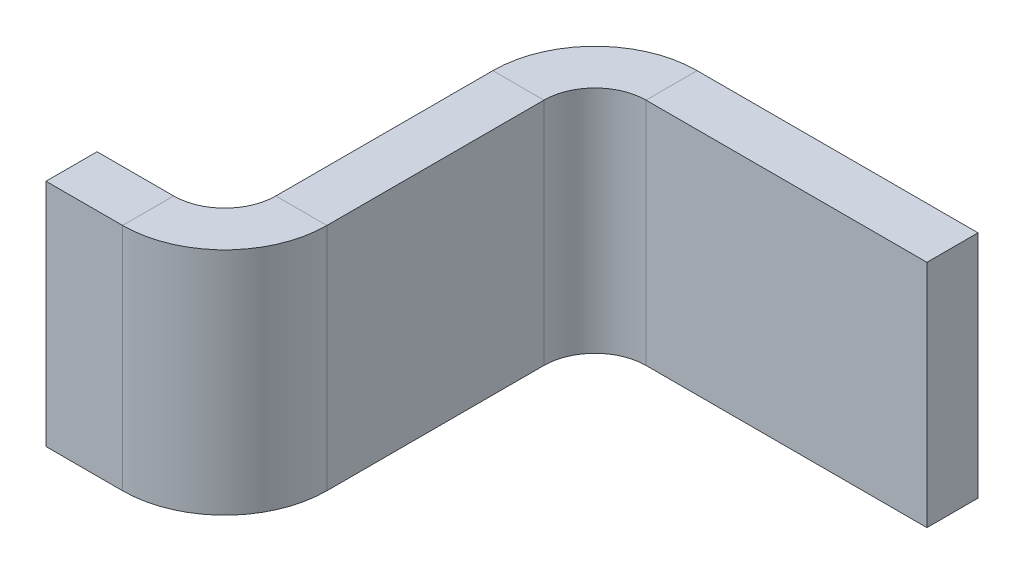
ISO-10303-21;
HEADER;
FILE_DESCRIPTION(('STEP AP214'),'2;1');
FILE_NAME('part.step','',(''),(''),'','','');
FILE_SCHEMA(('AUTOMOTIVE_DESIGN { 1 0 10303 214 1 1 1 1 }'));
ENDSEC;
DATA;
#1=APPLICATION_CONTEXT('core data for automotive mechanical design processes');
#2=APPLICATION_PROTOCOL_DEFINITION('international standard','automotive_design',2000,#1);
#3=PRODUCT_CONTEXT('',#1,'mechanical');
#4=PRODUCT('Part','Part','',(#3));
#5=PRODUCT_RELATED_PRODUCT_CATEGORY('part','',(#4));
#6=PRODUCT_DEFINITION_FORMATION('','',#4);
#7=PRODUCT_DEFINITION_CONTEXT('part definition',#1,'design');
#8=PRODUCT_DEFINITION('design','',#6,#7);
#9=PRODUCT_DEFINITION_SHAPE('','',#8);
#10=(LENGTH_UNIT() NAMED_UNIT(*) SI_UNIT(.MILLI.,.METRE.));
#11=(NAMED_UNIT(*) PLANE_ANGLE_UNIT() SI_UNIT($,.RADIAN.));
#12=(NAMED_UNIT(*) SI_UNIT($,.STERADIAN.) SOLID_ANGLE_UNIT());
#13=UNCERTAINTY_MEASURE_WITH_UNIT(LENGTH_MEASURE(1.E-05),#10,'distance_accuracy_value','');
#14=(GEOMETRIC_REPRESENTATION_CONTEXT(3) GLOBAL_UNCERTAINTY_ASSIGNED_CONTEXT((#13)) GLOBAL_UNIT_ASSIGNED_CONTEXT((#10,
#11,#12)) REPRESENTATION_CONTEXT('',''));
#15=CARTESIAN_POINT('',(0.,0.,0.));
#16=DIRECTION('',(0.,0.,1.));
#17=DIRECTION('',(1.,0.,0.));
#18=AXIS2_PLACEMENT_3D('',#15,#16,#17);
#19=CARTESIAN_POINT('',(1.,-0.225,0.));
#20=DIRECTION('',(-1.,0.,0.));
#21=DIRECTION('',(0.,0.,1.));
#22=AXIS2_PLACEMENT_3D('',#19,#20,#21);
#23=PLANE('',#22);
#24=DIRECTION('',(0.,-1.,0.));
#25=VECTOR('',#24,1.);
#26=CARTESIAN_POINT('',(1.,-0.225,0.));
#27=LINE('',#26,#25);
#28=CARTESIAN_POINT('',(1.,0.225,0.));
#29=VERTEX_POINT('',#28);
#30=CARTESIAN_POINT('',(1.,-0.225,0.));
#31=VERTEX_POINT('',#30);
#32=EDGE_CURVE('E175',#29,#31,#27,.T.);
#33=ORIENTED_EDGE('',*,*,#32,.F.);
#34=DIRECTION('',(0.,0.,-1.));
#35=VECTOR('',#34,1.);
#36=CARTESIAN_POINT('',(1.,0.225,0.));
#37=LINE('',#36,#35);
#38=CARTESIAN_POINT('',(1.,0.225,0.1));
#39=VERTEX_POINT('',#38);
#40=EDGE_CURVE('E11',#39,#29,#37,.T.);
#41=ORIENTED_EDGE('',*,*,#40,.F.);
#42=DIRECTION('',(0.,1.,0.));
#43=VECTOR('',#42,1.);
#44=CARTESIAN_POINT('',(1.,0.225,0.1));
#45=LINE('',#44,#43);
#46=CARTESIAN_POINT('',(1.,-0.225,0.1));
#47=VERTEX_POINT('',#46);
#48=EDGE_CURVE('E225',#47,#39,#45,.T.);
#49=ORIENTED_EDGE('',*,*,#48,.F.);
#50=DIRECTION('',(0.,0.,1.));
#51=VECTOR('',#50,1.);
#52=CARTESIAN_POINT('',(1.,-0.225,0.1));
#53=LINE('',#52,#51);
#54=EDGE_CURVE('E285',#31,#47,#53,.T.);
#55=ORIENTED_EDGE('',*,*,#54,.F.);
#56=EDGE_LOOP('',(#33,#41,#49,#55));
#57=FACE_BOUND('',#56,.T.);
#58=ADVANCED_FACE('F17',(#57),#23,.F.);
#59=CARTESIAN_POINT('',(0.45,0.225,0.));
#60=DIRECTION('',(0.,-1.,0.));
#61=DIRECTION('',(0.,0.,-1.));
#62=AXIS2_PLACEMENT_3D('',#59,#60,#61);
#63=PLANE('',#62);
#64=ORIENTED_EDGE('',*,*,#40,.T.);
#65=DIRECTION('',(1.,0.,0.));
#66=VECTOR('',#65,1.);
#67=CARTESIAN_POINT('',(0.45,0.225,0.));
#68=LINE('',#67,#66);
#69=CARTESIAN_POINT('',(0.45,0.225,0.));
#70=VERTEX_POINT('',#69);
#71=EDGE_CURVE('E232',#70,#29,#68,.T.);
#72=ORIENTED_EDGE('',*,*,#71,.F.);
#73=DIRECTION('',(0.,0.,-1.));
#74=VECTOR('',#73,1.);
#75=CARTESIAN_POINT('',(0.45,0.225,0.));
#76=LINE('',#75,#74);
#77=CARTESIAN_POINT('',(0.45,0.225,0.1));
#78=VERTEX_POINT('',#77);
#79=EDGE_CURVE('E28',#78,#70,#76,.T.);
#80=ORIENTED_EDGE('',*,*,#79,.F.);
#81=DIRECTION('',(1.,0.,0.));
#82=VECTOR('',#81,1.);
#83=CARTESIAN_POINT('',(0.45,0.225,0.1));
#84=LINE('',#83,#82);
#85=EDGE_CURVE('E229',#78,#39,#84,.T.);
#86=ORIENTED_EDGE('',*,*,#85,.T.);
#87=EDGE_LOOP('',(#64,#72,#80,#86));
#88=FACE_BOUND('',#87,.T.);
#89=ADVANCED_FACE('F418',(#88),#63,.F.);
#90=CARTESIAN_POINT('',(0.343933982822,0.225,0.09393398282202));
#91=DIRECTION('',(0.,1.,0.));
#92=DIRECTION('',(1.,0.,0.));
#93=AXIS2_PLACEMENT_3D('',#90,#91,#92);
#94=PLANE('',#93);
#95=CARTESIAN_POINT('',(0.45,0.225,0.2));
#96=DIRECTION('',(0.,-1.,0.));
#97=DIRECTION('',(0.,0.,-1.));
#98=AXIS2_PLACEMENT_3D('',#95,#96,#97);
#99=CIRCLE('',#98,0.1);
#100=CARTESIAN_POINT('',(0.35,0.225,0.2));
#101=VERTEX_POINT('',#100);
#102=EDGE_CURVE('E199',#101,#78,#99,.T.);
#103=ORIENTED_EDGE('',*,*,#102,.T.);
#104=ORIENTED_EDGE('',*,*,#79,.T.);
#105=CARTESIAN_POINT('',(0.45,0.225,0.2));
#106=DIRECTION('',(0.,-1.,0.));
#107=DIRECTION('',(0.,0.,-1.));
#108=AXIS2_PLACEMENT_3D('',#105,#106,#107);
#109=CIRCLE('',#108,0.2);
#110=CARTESIAN_POINT('',(0.25,0.225,0.2));
#111=VERTEX_POINT('',#110);
#112=EDGE_CURVE('E205',#111,#70,#109,.T.);
#113=ORIENTED_EDGE('',*,*,#112,.F.);
#114=DIRECTION('',(-1.,0.,0.));
#115=VECTOR('',#114,1.);
#116=CARTESIAN_POINT('',(0.25,0.225,0.2));
#117=LINE('',#116,#115);
#118=EDGE_CURVE('E169',#101,#111,#117,.T.);
#119=ORIENTED_EDGE('',*,*,#118,.F.);
#120=EDGE_LOOP('',(#103,#104,#113,#119));
#121=FACE_BOUND('',#120,.T.);
#122=ADVANCED_FACE('F265',(#121),#94,.T.);
#123=CARTESIAN_POINT('',(0.25,0.225,0.625));
#124=DIRECTION('',(0.,-1.,0.));
#125=DIRECTION('',(0.,0.,-1.));
#126=AXIS2_PLACEMENT_3D('',#123,#124,#125);
#127=PLANE('',#126);
#128=ORIENTED_EDGE('',*,*,#118,.T.);
#129=DIRECTION('',(0.,0.,-1.));
#130=VECTOR('',#129,1.);
#131=CARTESIAN_POINT('',(0.25,0.225,0.625));
#132=LINE('',#131,#130);
#133=CARTESIAN_POINT('',(0.25,0.225,0.625));
#134=VERTEX_POINT('',#133);
#135=EDGE_CURVE('E201',#134,#111,#132,.T.);
#136=ORIENTED_EDGE('',*,*,#135,.F.);
#137=DIRECTION('',(-1.,0.,0.));
#138=VECTOR('',#137,1.);
#139=CARTESIAN_POINT('',(0.25,0.225,0.625));
#140=LINE('',#139,#138);
#141=CARTESIAN_POINT('',(0.35,0.225,0.625));
#142=VERTEX_POINT('',#141);
#143=EDGE_CURVE('E171',#142,#134,#140,.T.);
#144=ORIENTED_EDGE('',*,*,#143,.F.);
#145=DIRECTION('',(0.,0.,-1.));
#146=VECTOR('',#145,1.);
#147=CARTESIAN_POINT('',(0.35,0.225,0.625));
#148=LINE('',#147,#146);
#149=EDGE_CURVE('E200',#142,#101,#148,.T.);
#150=ORIENTED_EDGE('',*,*,#149,.T.);
#151=EDGE_LOOP('',(#128,#136,#144,#150));
#152=FACE_BOUND('',#151,.T.);
#153=ADVANCED_FACE('F574',(#152),#127,.F.);
#154=CARTESIAN_POINT('',(0.256066017178,0.225,0.731066017178));
#155=DIRECTION('',(0.,1.,0.));
#156=DIRECTION('',(1.,0.,0.));
#157=AXIS2_PLACEMENT_3D('',#154,#155,#156);
#158=PLANE('',#157);
#159=CARTESIAN_POINT('',(0.15,0.225,0.625));
#160=DIRECTION('',(0.,1.,0.));
#161=DIRECTION('',(0.,0.,-1.));
#162=AXIS2_PLACEMENT_3D('',#159,#160,#161);
#163=CIRCLE('',#162,0.2);
#164=CARTESIAN_POINT('',(0.15,0.225,0.825));
#165=VERTEX_POINT('',#164);
#166=EDGE_CURVE('E255',#165,#142,#163,.T.);
#167=ORIENTED_EDGE('',*,*,#166,.T.);
#168=ORIENTED_EDGE('',*,*,#143,.T.);
#169=CARTESIAN_POINT('',(0.15,0.225,0.625));
#170=DIRECTION('',(0.,1.,0.));
#171=DIRECTION('',(0.,0.,-1.));
#172=AXIS2_PLACEMENT_3D('',#169,#170,#171);
#173=CIRCLE('',#172,0.1);
#174=CARTESIAN_POINT('',(0.15,0.225,0.725));
#175=VERTEX_POINT('',#174);
#176=EDGE_CURVE('E195',#175,#134,#173,.T.);
#177=ORIENTED_EDGE('',*,*,#176,.F.);
#178=DIRECTION('',(0.,0.,-1.));
#179=VECTOR('',#178,1.);
#180=CARTESIAN_POINT('',(0.15,0.225,0.725));
#181=LINE('',#180,#179);
#182=EDGE_CURVE('E137',#165,#175,#181,.T.);
#183=ORIENTED_EDGE('',*,*,#182,.F.);
#184=EDGE_LOOP('',(#167,#168,#177,#183));
#185=FACE_BOUND('',#184,.T.);
#186=ADVANCED_FACE('F402',(#185),#158,.T.);
#187=CARTESIAN_POINT('',(0.,0.225,0.725));
#188=DIRECTION('',(0.,-1.,0.));
#189=DIRECTION('',(0.,0.,-1.));
#190=AXIS2_PLACEMENT_3D('',#187,#188,#189);
#191=PLANE('',#190);
#192=ORIENTED_EDGE('',*,*,#182,.T.);
#193=DIRECTION('',(1.,0.,0.));
#194=VECTOR('',#193,1.);
#195=CARTESIAN_POINT('',(0.,0.225,0.725));
#196=LINE('',#195,#194);
#197=CARTESIAN_POINT('',(0.,0.225,0.725));
#198=VERTEX_POINT('',#197);
#199=EDGE_CURVE('E130',#198,#175,#196,.T.);
#200=ORIENTED_EDGE('',*,*,#199,.F.);
#201=DIRECTION('',(0.,0.,-1.));
#202=VECTOR('',#201,1.);
#203=CARTESIAN_POINT('',(0.,0.225,0.725));
#204=LINE('',#203,#202);
#205=CARTESIAN_POINT('',(0.,0.225,0.825));
#206=VERTEX_POINT('',#205);
#207=EDGE_CURVE('E135',#206,#198,#204,.T.);
#208=ORIENTED_EDGE('',*,*,#207,.F.);
#209=DIRECTION('',(1.,0.,0.));
#210=VECTOR('',#209,1.);
#211=CARTESIAN_POINT('',(0.,0.225,0.825));
#212=LINE('',#211,#210);
#213=EDGE_CURVE('E217',#206,#165,#212,.T.);
#214=ORIENTED_EDGE('',*,*,#213,.T.);
#215=EDGE_LOOP('',(#192,#200,#208,#214));
#216=FACE_BOUND('',#215,.T.);
#217=ADVANCED_FACE('F132',(#216),#191,.F.);
#218=CARTESIAN_POINT('',(0.45,0.225,0.1));
#219=DIRECTION('',(0.,0.,-1.));
#220=DIRECTION('',(0.,-1.,0.));
#221=AXIS2_PLACEMENT_3D('',#218,#219,#220);
#222=PLANE('',#221);
#223=ORIENTED_EDGE('',*,*,#48,.T.);
#224=ORIENTED_EDGE('',*,*,#85,.F.);
#225=DIRECTION('',(0.,-1.,0.));
#226=VECTOR('',#225,1.);
#227=CARTESIAN_POINT('',(0.45,0.225,0.1));
#228=LINE('',#227,#226);
#229=CARTESIAN_POINT('',(0.45,-0.225,0.1));
#230=VERTEX_POINT('',#229);
#231=EDGE_CURVE('E196',#78,#230,#228,.T.);
#232=ORIENTED_EDGE('',*,*,#231,.T.);
#233=DIRECTION('',(1.,0.,0.));
#234=VECTOR('',#233,1.);
#235=CARTESIAN_POINT('',(0.45,-0.225,0.1));
#236=LINE('',#235,#234);
#237=EDGE_CURVE('E279',#230,#47,#236,.T.);
#238=ORIENTED_EDGE('',*,*,#237,.T.);
#239=EDGE_LOOP('',(#223,#224,#232,#238));
#240=FACE_BOUND('',#239,.T.);
#241=ADVANCED_FACE('F278',(#240),#222,.F.);
#242=CARTESIAN_POINT('',(0.45,0.225,0.2));
#243=DIRECTION('',(0.,-1.,0.));
#244=DIRECTION('',(0.,0.,-1.));
#245=AXIS2_PLACEMENT_3D('',#242,#243,#244);
#246=CYLINDRICAL_SURFACE('',#245,0.1);
#247=ORIENTED_EDGE('',*,*,#231,.F.);
#248=ORIENTED_EDGE('',*,*,#102,.F.);
#249=DIRECTION('',(0.,1.,0.));
#250=VECTOR('',#249,1.);
#251=CARTESIAN_POINT('',(0.35,0.225,0.2));
#252=LINE('',#251,#250);
#253=CARTESIAN_POINT('',(0.35,-0.225,0.2));
#254=VERTEX_POINT('',#253);
#255=EDGE_CURVE('E258',#254,#101,#252,.T.);
#256=ORIENTED_EDGE('',*,*,#255,.F.);
#257=CARTESIAN_POINT('',(0.45,-0.225,0.2));
#258=DIRECTION('',(0.,-1.,0.));
#259=DIRECTION('',(0.,0.,-1.));
#260=AXIS2_PLACEMENT_3D('',#257,#258,#259);
#261=CIRCLE('',#260,0.1);
#262=EDGE_CURVE('E272',#254,#230,#261,.T.);
#263=ORIENTED_EDGE('',*,*,#262,.T.);
#264=EDGE_LOOP('',(#247,#248,#256,#263));
#265=FACE_BOUND('',#264,.T.);
#266=ADVANCED_FACE('F270',(#265),#246,.F.);
#267=CARTESIAN_POINT('',(0.35,0.225,0.625));
#268=DIRECTION('',(-1.,0.,0.));
#269=DIRECTION('',(0.,0.,1.));
#270=AXIS2_PLACEMENT_3D('',#267,#268,#269);
#271=PLANE('',#270);
#272=ORIENTED_EDGE('',*,*,#255,.T.);
#273=ORIENTED_EDGE('',*,*,#149,.F.);
#274=DIRECTION('',(0.,1.,0.));
#275=VECTOR('',#274,1.);
#276=CARTESIAN_POINT('',(0.35,0.225,0.625));
#277=LINE('',#276,#275);
#278=CARTESIAN_POINT('',(0.35,-0.225,0.625));
#279=VERTEX_POINT('',#278);
#280=EDGE_CURVE('E220',#279,#142,#277,.T.);
#281=ORIENTED_EDGE('',*,*,#280,.F.);
#282=DIRECTION('',(0.,0.,-1.));
#283=VECTOR('',#282,1.);
#284=CARTESIAN_POINT('',(0.35,-0.225,0.625));
#285=LINE('',#284,#283);
#286=EDGE_CURVE('E254',#279,#254,#285,.T.);
#287=ORIENTED_EDGE('',*,*,#286,.T.);
#288=EDGE_LOOP('',(#272,#273,#281,#287));
#289=FACE_BOUND('',#288,.T.);
#290=ADVANCED_FACE('F394',(#289),#271,.F.);
#291=CARTESIAN_POINT('',(0.15,0.225,0.625));
#292=DIRECTION('',(0.,1.,0.));
#293=DIRECTION('',(0.,0.,-1.));
#294=AXIS2_PLACEMENT_3D('',#291,#292,#293);
#295=CYLINDRICAL_SURFACE('',#294,0.2);
#296=CARTESIAN_POINT('',(0.15,-0.225,0.625));
#297=DIRECTION('',(0.,1.,0.));
#298=DIRECTION('',(0.,0.,-1.));
#299=AXIS2_PLACEMENT_3D('',#296,#297,#298);
#300=CIRCLE('',#299,0.2);
#301=CARTESIAN_POINT('',(0.15,-0.225,0.825));
#302=VERTEX_POINT('',#301);
#303=EDGE_CURVE('E215',#302,#279,#300,.T.);
#304=ORIENTED_EDGE('',*,*,#303,.T.);
#305=ORIENTED_EDGE('',*,*,#280,.T.);
#306=ORIENTED_EDGE('',*,*,#166,.F.);
#307=DIRECTION('',(0.,1.,0.));
#308=VECTOR('',#307,1.);
#309=CARTESIAN_POINT('',(0.15,0.225,0.825));
#310=LINE('',#309,#308);
#311=EDGE_CURVE('E21',#302,#165,#310,.T.);
#312=ORIENTED_EDGE('',*,*,#311,.F.);
#313=EDGE_LOOP('',(#304,#305,#306,#312));
#314=FACE_BOUND('',#313,.T.);
#315=ADVANCED_FACE('F363',(#314),#295,.T.);
#316=CARTESIAN_POINT('',(0.,0.225,0.825));
#317=DIRECTION('',(0.,0.,-1.));
#318=DIRECTION('',(0.,-1.,0.));
#319=AXIS2_PLACEMENT_3D('',#316,#317,#318);
#320=PLANE('',#319);
#321=ORIENTED_EDGE('',*,*,#311,.T.);
#322=ORIENTED_EDGE('',*,*,#213,.F.);
#323=DIRECTION('',(0.,1.,0.));
#324=VECTOR('',#323,1.);
#325=CARTESIAN_POINT('',(0.,0.225,0.825));
#326=LINE('',#325,#324);
#327=CARTESIAN_POINT('',(0.,-0.225,0.825));
#328=VERTEX_POINT('',#327);
#329=EDGE_CURVE('E159',#328,#206,#326,.T.);
#330=ORIENTED_EDGE('',*,*,#329,.F.);
#331=DIRECTION('',(1.,0.,0.));
#332=VECTOR('',#331,1.);
#333=CARTESIAN_POINT('',(0.,-0.225,0.825));
#334=LINE('',#333,#332);
#335=EDGE_CURVE('E216',#328,#302,#334,.T.);
#336=ORIENTED_EDGE('',*,*,#335,.T.);
#337=EDGE_LOOP('',(#321,#322,#330,#336));
#338=FACE_BOUND('',#337,.T.);
#339=ADVANCED_FACE('F358',(#338),#320,.F.);
#340=CARTESIAN_POINT('',(0.45,-0.225,0.1));
#341=DIRECTION('',(0.,1.,0.));
#342=DIRECTION('',(1.,0.,0.));
#343=AXIS2_PLACEMENT_3D('',#340,#341,#342);
#344=PLANE('',#343);
#345=ORIENTED_EDGE('',*,*,#54,.T.);
#346=ORIENTED_EDGE('',*,*,#237,.F.);
#347=DIRECTION('',(0.,0.,1.));
#348=VECTOR('',#347,1.);
#349=CARTESIAN_POINT('',(0.45,-0.225,0.1));
#350=LINE('',#349,#348);
#351=CARTESIAN_POINT('',(0.45,-0.225,0.));
#352=VERTEX_POINT('',#351);
#353=EDGE_CURVE('E283',#352,#230,#350,.T.);
#354=ORIENTED_EDGE('',*,*,#353,.F.);
#355=DIRECTION('',(1.,0.,0.));
#356=VECTOR('',#355,1.);
#357=CARTESIAN_POINT('',(0.45,-0.225,0.));
#358=LINE('',#357,#356);
#359=EDGE_CURVE('E236',#352,#31,#358,.T.);
#360=ORIENTED_EDGE('',*,*,#359,.T.);
#361=EDGE_LOOP('',(#345,#346,#354,#360));
#362=FACE_BOUND('',#361,.T.);
#363=ADVANCED_FACE('F282',(#362),#344,.F.);
#364=CARTESIAN_POINT('',(0.343933982822,-0.225,0.09393398282202));
#365=DIRECTION('',(0.,-1.,0.));
#366=DIRECTION('',(0.,0.,-1.));
#367=AXIS2_PLACEMENT_3D('',#364,#365,#366);
#368=PLANE('',#367);
#369=CARTESIAN_POINT('',(0.45,-0.225,0.2));
#370=DIRECTION('',(0.,-1.,0.));
#371=DIRECTION('',(0.,0.,-1.));
#372=AXIS2_PLACEMENT_3D('',#369,#370,#371);
#373=CIRCLE('',#372,0.2);
#374=CARTESIAN_POINT('',(0.25,-0.225,0.2));
#375=VERTEX_POINT('',#374);
#376=EDGE_CURVE('E172',#375,#352,#373,.T.);
#377=ORIENTED_EDGE('',*,*,#376,.T.);
#378=ORIENTED_EDGE('',*,*,#353,.T.);
#379=ORIENTED_EDGE('',*,*,#262,.F.);
#380=DIRECTION('',(1.,0.,0.));
#381=VECTOR('',#380,1.);
#382=CARTESIAN_POINT('',(0.35,-0.225,0.2));
#383=LINE('',#382,#381);
#384=EDGE_CURVE('E250',#375,#254,#383,.T.);
#385=ORIENTED_EDGE('',*,*,#384,.F.);
#386=EDGE_LOOP('',(#377,#378,#379,#385));
#387=FACE_BOUND('',#386,.T.);
#388=ADVANCED_FACE('F391',(#387),#368,.T.);
#389=CARTESIAN_POINT('',(0.35,-0.225,0.625));
#390=DIRECTION('',(0.,1.,0.));
#391=DIRECTION('',(1.,0.,0.));
#392=AXIS2_PLACEMENT_3D('',#389,#390,#391);
#393=PLANE('',#392);
#394=ORIENTED_EDGE('',*,*,#384,.T.);
#395=ORIENTED_EDGE('',*,*,#286,.F.);
#396=DIRECTION('',(1.,0.,0.));
#397=VECTOR('',#396,1.);
#398=CARTESIAN_POINT('',(0.35,-0.225,0.625));
#399=LINE('',#398,#397);
#400=CARTESIAN_POINT('',(0.25,-0.225,0.625));
#401=VERTEX_POINT('',#400);
#402=EDGE_CURVE('E211',#401,#279,#399,.T.);
#403=ORIENTED_EDGE('',*,*,#402,.F.);
#404=DIRECTION('',(0.,0.,-1.));
#405=VECTOR('',#404,1.);
#406=CARTESIAN_POINT('',(0.25,-0.225,0.625));
#407=LINE('',#406,#405);
#408=EDGE_CURVE('E194',#401,#375,#407,.T.);
#409=ORIENTED_EDGE('',*,*,#408,.T.);
#410=EDGE_LOOP('',(#394,#395,#403,#409));
#411=FACE_BOUND('',#410,.T.);
#412=ADVANCED_FACE('F381',(#411),#393,.F.);
#413=CARTESIAN_POINT('',(0.256066017178,-0.225,0.731066017178));
#414=DIRECTION('',(0.,-1.,0.));
#415=DIRECTION('',(0.,0.,-1.));
#416=AXIS2_PLACEMENT_3D('',#413,#414,#415);
#417=PLANE('',#416);
#418=CARTESIAN_POINT('',(0.15,-0.225,0.625));
#419=DIRECTION('',(0.,1.,0.));
#420=DIRECTION('',(0.,0.,-1.));
#421=AXIS2_PLACEMENT_3D('',#418,#419,#420);
#422=CIRCLE('',#421,0.1);
#423=CARTESIAN_POINT('',(0.15,-0.225,0.725));
#424=VERTEX_POINT('',#423);
#425=EDGE_CURVE('E189',#424,#401,#422,.T.);
#426=ORIENTED_EDGE('',*,*,#425,.T.);
#427=ORIENTED_EDGE('',*,*,#402,.T.);
#428=ORIENTED_EDGE('',*,*,#303,.F.);
#429=DIRECTION('',(0.,0.,1.));
#430=VECTOR('',#429,1.);
#431=CARTESIAN_POINT('',(0.15,-0.225,0.825));
#432=LINE('',#431,#430);
#433=EDGE_CURVE('E224',#424,#302,#432,.T.);
#434=ORIENTED_EDGE('',*,*,#433,.F.);
#435=EDGE_LOOP('',(#426,#427,#428,#434));
#436=FACE_BOUND('',#435,.T.);
#437=ADVANCED_FACE('F19',(#436),#417,.T.);
#438=CARTESIAN_POINT('',(0.,-0.225,0.825));
#439=DIRECTION('',(0.,1.,0.));
#440=DIRECTION('',(1.,0.,0.));
#441=AXIS2_PLACEMENT_3D('',#438,#439,#440);
#442=PLANE('',#441);
#443=ORIENTED_EDGE('',*,*,#433,.T.);
#444=ORIENTED_EDGE('',*,*,#335,.F.);
#445=DIRECTION('',(0.,0.,1.));
#446=VECTOR('',#445,1.);
#447=CARTESIAN_POINT('',(0.,-0.225,0.825));
#448=LINE('',#447,#446);
#449=CARTESIAN_POINT('',(0.,-0.225,0.725));
#450=VERTEX_POINT('',#449);
#451=EDGE_CURVE('E165',#450,#328,#448,.T.);
#452=ORIENTED_EDGE('',*,*,#451,.F.);
#453=DIRECTION('',(1.,0.,0.));
#454=VECTOR('',#453,1.);
#455=CARTESIAN_POINT('',(0.,-0.225,0.725));
#456=LINE('',#455,#454);
#457=EDGE_CURVE('E144',#450,#424,#456,.T.);
#458=ORIENTED_EDGE('',*,*,#457,.T.);
#459=EDGE_LOOP('',(#443,#444,#452,#458));
#460=FACE_BOUND('',#459,.T.);
#461=ADVANCED_FACE('F310',(#460),#442,.F.);
#462=CARTESIAN_POINT('',(0.45,-0.225,0.));
#463=DIRECTION('',(0.,0.,1.));
#464=DIRECTION('',(1.,0.,0.));
#465=AXIS2_PLACEMENT_3D('',#462,#463,#464);
#466=PLANE('',#465);
#467=ORIENTED_EDGE('',*,*,#32,.T.);
#468=ORIENTED_EDGE('',*,*,#359,.F.);
#469=DIRECTION('',(0.,-1.,0.));
#470=VECTOR('',#469,1.);
#471=CARTESIAN_POINT('',(0.45,-0.225,0.));
#472=LINE('',#471,#470);
#473=EDGE_CURVE('E176',#70,#352,#472,.T.);
#474=ORIENTED_EDGE('',*,*,#473,.F.);
#475=ORIENTED_EDGE('',*,*,#71,.T.);
#476=EDGE_LOOP('',(#467,#468,#474,#475));
#477=FACE_BOUND('',#476,.T.);
#478=ADVANCED_FACE('F472',(#477),#466,.F.);
#479=CARTESIAN_POINT('',(0.45,-0.225,0.2));
#480=DIRECTION('',(0.,-1.,0.));
#481=DIRECTION('',(0.,0.,-1.));
#482=AXIS2_PLACEMENT_3D('',#479,#480,#481);
#483=CYLINDRICAL_SURFACE('',#482,0.2);
#484=ORIENTED_EDGE('',*,*,#112,.T.);
#485=ORIENTED_EDGE('',*,*,#473,.T.);
#486=ORIENTED_EDGE('',*,*,#376,.F.);
#487=DIRECTION('',(0.,-1.,0.));
#488=VECTOR('',#487,1.);
#489=CARTESIAN_POINT('',(0.25,-0.225,0.2));
#490=LINE('',#489,#488);
#491=EDGE_CURVE('E191',#111,#375,#490,.T.);
#492=ORIENTED_EDGE('',*,*,#491,.F.);
#493=EDGE_LOOP('',(#484,#485,#486,#492));
#494=FACE_BOUND('',#493,.T.);
#495=ADVANCED_FACE('F389',(#494),#483,.T.);
#496=CARTESIAN_POINT('',(0.25,-0.225,0.625));
#497=DIRECTION('',(1.,0.,0.));
#498=DIRECTION('',(0.,1.,0.));
#499=AXIS2_PLACEMENT_3D('',#496,#497,#498);
#500=PLANE('',#499);
#501=ORIENTED_EDGE('',*,*,#491,.T.);
#502=ORIENTED_EDGE('',*,*,#408,.F.);
#503=DIRECTION('',(0.,1.,0.));
#504=VECTOR('',#503,1.);
#505=CARTESIAN_POINT('',(0.25,-0.225,0.625));
#506=LINE('',#505,#504);
#507=EDGE_CURVE('E143',#401,#134,#506,.T.);
#508=ORIENTED_EDGE('',*,*,#507,.T.);
#509=ORIENTED_EDGE('',*,*,#135,.T.);
#510=EDGE_LOOP('',(#501,#502,#508,#509));
#511=FACE_BOUND('',#510,.T.);
#512=ADVANCED_FACE('F385',(#511),#500,.F.);
#513=CARTESIAN_POINT('',(0.15,-0.225,0.625));
#514=DIRECTION('',(0.,1.,0.));
#515=DIRECTION('',(0.,0.,-1.));
#516=AXIS2_PLACEMENT_3D('',#513,#514,#515);
#517=CYLINDRICAL_SURFACE('',#516,0.1);
#518=ORIENTED_EDGE('',*,*,#507,.F.);
#519=ORIENTED_EDGE('',*,*,#425,.F.);
#520=DIRECTION('',(0.,-1.,0.));
#521=VECTOR('',#520,1.);
#522=CARTESIAN_POINT('',(0.15,-0.225,0.725));
#523=LINE('',#522,#521);
#524=EDGE_CURVE('E155',#175,#424,#523,.T.);
#525=ORIENTED_EDGE('',*,*,#524,.F.);
#526=ORIENTED_EDGE('',*,*,#176,.T.);
#527=EDGE_LOOP('',(#518,#519,#525,#526));
#528=FACE_BOUND('',#527,.T.);
#529=ADVANCED_FACE('F405',(#528),#517,.F.);
#530=CARTESIAN_POINT('',(0.,-0.225,0.725));
#531=DIRECTION('',(0.,0.,1.));
#532=DIRECTION('',(1.,0.,0.));
#533=AXIS2_PLACEMENT_3D('',#530,#531,#532);
#534=PLANE('',#533);
#535=ORIENTED_EDGE('',*,*,#524,.T.);
#536=ORIENTED_EDGE('',*,*,#457,.F.);
#537=DIRECTION('',(0.,-1.,0.));
#538=VECTOR('',#537,1.);
#539=CARTESIAN_POINT('',(0.,-0.225,0.725));
#540=LINE('',#539,#538);
#541=EDGE_CURVE('E148',#198,#450,#540,.T.);
#542=ORIENTED_EDGE('',*,*,#541,.F.);
#543=ORIENTED_EDGE('',*,*,#199,.T.);
#544=EDGE_LOOP('',(#535,#536,#542,#543));
#545=FACE_BOUND('',#544,.T.);
#546=ADVANCED_FACE('F149',(#545),#534,.F.);
#547=CARTESIAN_POINT('',(0.,-0.225,0.725));
#548=DIRECTION('',(-1.,0.,0.));
#549=DIRECTION('',(0.,0.,1.));
#550=AXIS2_PLACEMENT_3D('',#547,#548,#549);
#551=PLANE('',#550);
#552=ORIENTED_EDGE('',*,*,#451,.T.);
#553=ORIENTED_EDGE('',*,*,#329,.T.);
#554=ORIENTED_EDGE('',*,*,#207,.T.);
#555=ORIENTED_EDGE('',*,*,#541,.T.);
#556=EDGE_LOOP('',(#552,#553,#554,#555));
#557=FACE_BOUND('',#556,.T.);
#558=ADVANCED_FACE('F157',(#557),#551,.T.);
#559=CLOSED_SHELL('',(#58,#89,#122,#153,#186,#217,#241,#266,#290,#315,#339,#363,#388,#412,#437,
#461,#478,#495,#512,#529,#546,#558));
#560=MANIFOLD_SOLID_BREP('B1',#559);
#561=ADVANCED_BREP_SHAPE_REPRESENTATION('',(#18,#560),#14);
#562=SHAPE_DEFINITION_REPRESENTATION(#9,#561);
ENDSEC;
END-ISO-10303-21;
